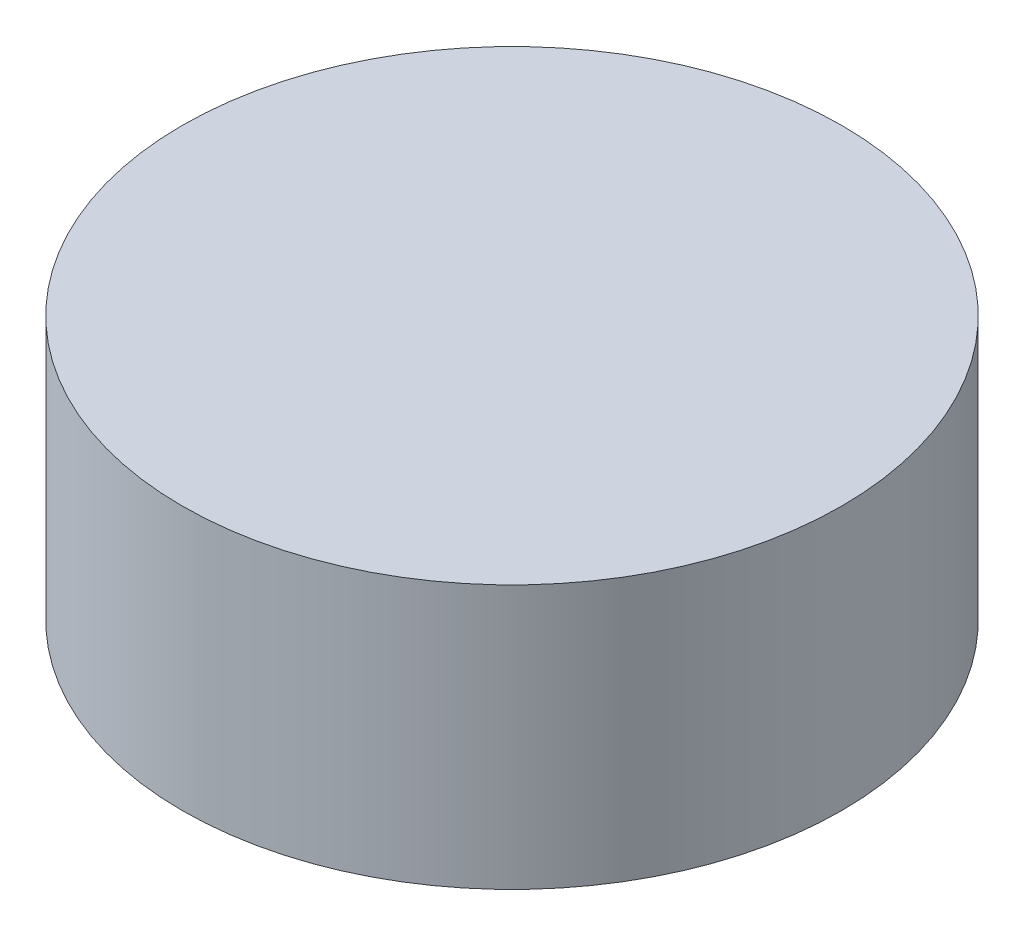
ISO-10303-21;
HEADER;
FILE_DESCRIPTION(('STEP AP214'),'2;1');
FILE_NAME('part.step','',(''),(''),'','','');
FILE_SCHEMA(('AUTOMOTIVE_DESIGN { 1 0 10303 214 1 1 1 1 }'));
ENDSEC;
DATA;
#1=APPLICATION_CONTEXT('core data for automotive mechanical design processes');
#2=APPLICATION_PROTOCOL_DEFINITION('international standard','automotive_design',2000,#1);
#3=PRODUCT_CONTEXT('',#1,'mechanical');
#4=PRODUCT('Part','Part','',(#3));
#5=PRODUCT_RELATED_PRODUCT_CATEGORY('part','',(#4));
#6=PRODUCT_DEFINITION_FORMATION('','',#4);
#7=PRODUCT_DEFINITION_CONTEXT('part definition',#1,'design');
#8=PRODUCT_DEFINITION('design','',#6,#7);
#9=PRODUCT_DEFINITION_SHAPE('','',#8);
#10=(LENGTH_UNIT() NAMED_UNIT(*) SI_UNIT(.MILLI.,.METRE.));
#11=(NAMED_UNIT(*) PLANE_ANGLE_UNIT() SI_UNIT($,.RADIAN.));
#12=(NAMED_UNIT(*) SI_UNIT($,.STERADIAN.) SOLID_ANGLE_UNIT());
#13=UNCERTAINTY_MEASURE_WITH_UNIT(LENGTH_MEASURE(1.E-05),#10,'distance_accuracy_value','');
#14=(GEOMETRIC_REPRESENTATION_CONTEXT(3) GLOBAL_UNCERTAINTY_ASSIGNED_CONTEXT((#13)) GLOBAL_UNIT_ASSIGNED_CONTEXT((#10,
#11,#12)) REPRESENTATION_CONTEXT('',''));
#15=CARTESIAN_POINT('',(0.,0.,0.));
#16=DIRECTION('',(0.,0.,1.));
#17=DIRECTION('',(1.,0.,0.));
#18=AXIS2_PLACEMENT_3D('',#15,#16,#17);
#19=CARTESIAN_POINT('',(0.,50.,0.));
#20=DIRECTION('',(0.,-1.,0.));
#21=DIRECTION('',(0.,0.,-1.));
#22=AXIS2_PLACEMENT_3D('',#19,#20,#21);
#23=CYLINDRICAL_SURFACE('',#22,125.);
#24=CARTESIAN_POINT('',(0.,50.,0.));
#25=DIRECTION('',(0.,1.,0.));
#26=DIRECTION('',(0.,0.,1.));
#27=AXIS2_PLACEMENT_3D('',#24,#25,#26);
#28=CIRCLE('',#27,125.);
#29=CARTESIAN_POINT('',(0.,50.,125.));
#30=VERTEX_POINT('',#29);
#31=EDGE_CURVE('E10',#30,#30,#28,.T.);
#32=ORIENTED_EDGE('',*,*,#31,.F.);
#33=EDGE_LOOP('',(#32));
#34=FACE_BOUND('',#33,.T.);
#35=CARTESIAN_POINT('',(0.,-50.,0.));
#36=DIRECTION('',(0.,1.,0.));
#37=DIRECTION('',(0.,0.,1.));
#38=AXIS2_PLACEMENT_3D('',#35,#36,#37);
#39=CIRCLE('',#38,125.);
#40=CARTESIAN_POINT('',(0.,-50.,125.));
#41=VERTEX_POINT('',#40);
#42=EDGE_CURVE('E40',#41,#41,#39,.T.);
#43=ORIENTED_EDGE('',*,*,#42,.T.);
#44=EDGE_LOOP('',(#43));
#45=FACE_BOUND('',#44,.T.);
#46=ADVANCED_FACE('F37',(#34,#45),#23,.T.);
#47=CARTESIAN_POINT('',(0.,50.,0.));
#48=DIRECTION('',(0.,1.,0.));
#49=DIRECTION('',(0.,0.,1.));
#50=AXIS2_PLACEMENT_3D('',#47,#48,#49);
#51=PLANE('',#50);
#52=ORIENTED_EDGE('',*,*,#31,.T.);
#53=EDGE_LOOP('',(#52));
#54=FACE_BOUND('',#53,.T.);
#55=ADVANCED_FACE('F54',(#54),#51,.T.);
#56=CARTESIAN_POINT('',(0.,-50.,0.));
#57=DIRECTION('',(0.,1.,0.));
#58=DIRECTION('',(0.,0.,1.));
#59=AXIS2_PLACEMENT_3D('',#56,#57,#58);
#60=PLANE('',#59);
#61=ORIENTED_EDGE('',*,*,#42,.F.);
#62=EDGE_LOOP('',(#61));
#63=FACE_BOUND('',#62,.T.);
#64=ADVANCED_FACE('F52',(#63),#60,.F.);
#65=CLOSED_SHELL('',(#46,#55,#64));
#66=MANIFOLD_SOLID_BREP('B2',#65);
#67=ADVANCED_BREP_SHAPE_REPRESENTATION('',(#18,#66),#14);
#68=SHAPE_DEFINITION_REPRESENTATION(#9,#67);
ENDSEC;
END-ISO-10303-21;
